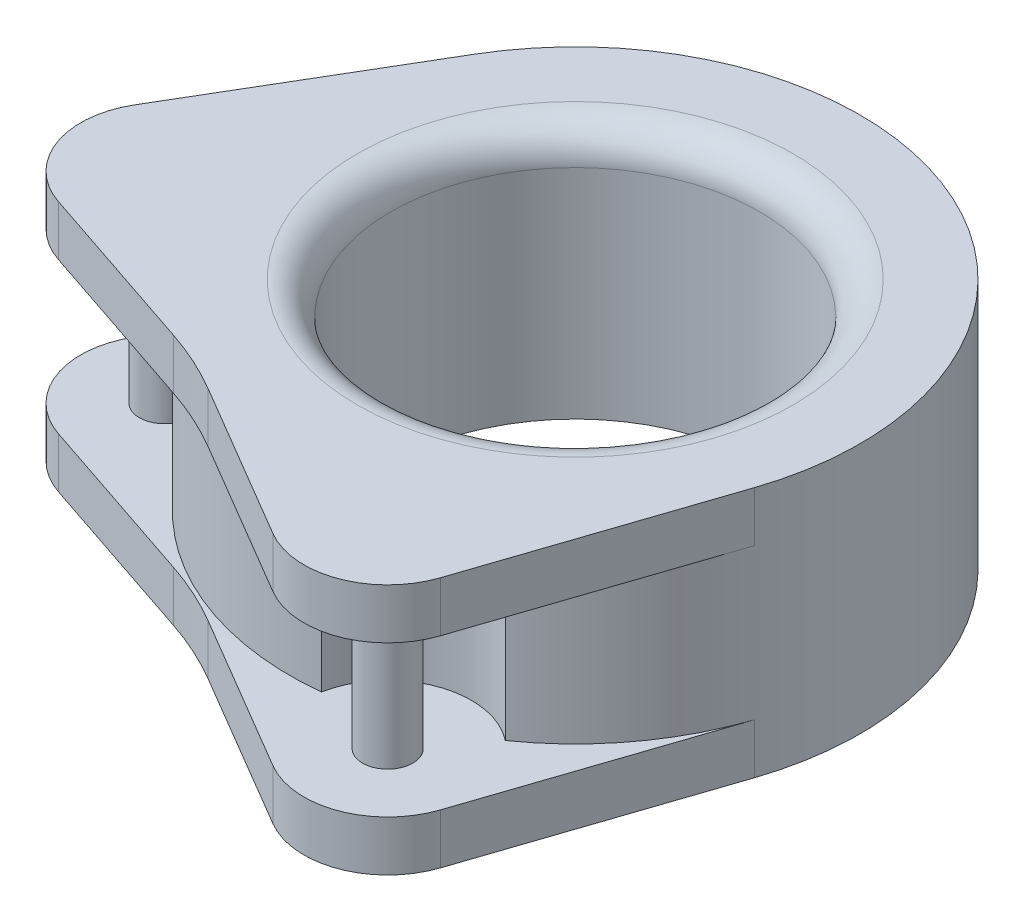
ISO-10303-21;
HEADER;
FILE_DESCRIPTION(('STEP AP214'),'2;1');
FILE_NAME('part.step','',(''),(''),'','','');
FILE_SCHEMA(('AUTOMOTIVE_DESIGN { 1 0 10303 214 1 1 1 1 }'));
ENDSEC;
DATA;
#1=APPLICATION_CONTEXT('core data for automotive mechanical design processes');
#2=APPLICATION_PROTOCOL_DEFINITION('international standard','automotive_design',2000,#1);
#3=PRODUCT_CONTEXT('',#1,'mechanical');
#4=PRODUCT('Part','Part','',(#3));
#5=PRODUCT_RELATED_PRODUCT_CATEGORY('part','',(#4));
#6=PRODUCT_DEFINITION_FORMATION('','',#4);
#7=PRODUCT_DEFINITION_CONTEXT('part definition',#1,'design');
#8=PRODUCT_DEFINITION('design','',#6,#7);
#9=PRODUCT_DEFINITION_SHAPE('','',#8);
#10=(LENGTH_UNIT() NAMED_UNIT(*) SI_UNIT(.MILLI.,.METRE.));
#11=(NAMED_UNIT(*) PLANE_ANGLE_UNIT() SI_UNIT($,.RADIAN.));
#12=(NAMED_UNIT(*) SI_UNIT($,.STERADIAN.) SOLID_ANGLE_UNIT());
#13=UNCERTAINTY_MEASURE_WITH_UNIT(LENGTH_MEASURE(1.E-05),#10,'distance_accuracy_value','');
#14=(GEOMETRIC_REPRESENTATION_CONTEXT(3) GLOBAL_UNCERTAINTY_ASSIGNED_CONTEXT((#13)) GLOBAL_UNIT_ASSIGNED_CONTEXT((#10,
#11,#12)) REPRESENTATION_CONTEXT('',''));
#15=CARTESIAN_POINT('',(0.,0.,0.));
#16=DIRECTION('',(0.,0.,1.));
#17=DIRECTION('',(1.,0.,0.));
#18=AXIS2_PLACEMENT_3D('',#15,#16,#17);
#19=CARTESIAN_POINT('',(-14.6450677837833,-31.7471230269605,-8.63261198064591));
#20=DIRECTION('',(-0.861474575516667,0.,-0.507800704743877));
#21=DIRECTION('',(-0.507800704743877,0.,0.861474575516667));
#22=AXIS2_PLACEMENT_3D('',#19,#20,#21);
#23=PLANE('',#22);
#24=DIRECTION('',(0.,1.,0.));
#25=VECTOR('',#24,1.);
#26=CARTESIAN_POINT('',(-22.1639271566175,-31.7471230269605,4.12299494559652));
#27=LINE('',#26,#25);
#28=CARTESIAN_POINT('',(-22.1639271566175,0.,4.12299494559653));
#29=VERTEX_POINT('',#28);
#30=CARTESIAN_POINT('',(-22.1639271566175,3.,4.12299494559652));
#31=VERTEX_POINT('',#30);
#32=EDGE_CURVE('E191',#29,#31,#27,.T.);
#33=ORIENTED_EDGE('',*,*,#32,.T.);
#34=DIRECTION('',(0.507800704743877,0.,-0.861474575516667));
#35=VECTOR('',#34,1.);
#36=CARTESIAN_POINT('',(-14.6450677837833,3.,-8.63261198064591));
#37=LINE('',#36,#35);
#38=CARTESIAN_POINT('',(-14.6450677837833,3.,-8.63261198064592));
#39=VERTEX_POINT('',#38);
#40=EDGE_CURVE('E177',#31,#39,#37,.T.);
#41=ORIENTED_EDGE('',*,*,#40,.T.);
#42=DIRECTION('',(0.,1.,0.));
#43=VECTOR('',#42,1.);
#44=CARTESIAN_POINT('',(-14.6450677837833,-31.7471230269605,-8.63261198064592));
#45=LINE('',#44,#43);
#46=CARTESIAN_POINT('',(-14.6450677837833,0.,-8.63261198064592));
#47=VERTEX_POINT('',#46);
#48=EDGE_CURVE('E189',#47,#39,#45,.T.);
#49=ORIENTED_EDGE('',*,*,#48,.F.);
#50=DIRECTION('',(0.507800704743877,0.,-0.861474575516667));
#51=VECTOR('',#50,1.);
#52=CARTESIAN_POINT('',(-14.6450677837833,0.,-8.63261198064591));
#53=LINE('',#52,#51);
#54=EDGE_CURVE('E198',#29,#47,#53,.T.);
#55=ORIENTED_EDGE('',*,*,#54,.F.);
#56=EDGE_LOOP('',(#33,#41,#49,#55));
#57=FACE_BOUND('',#56,.T.);
#58=ADVANCED_FACE('F35',(#57),#23,.T.);
#59=CARTESIAN_POINT('',(-25.2967852286317,-31.7471230269605,9.4378311648642));
#60=DIRECTION('',(-0.318348055173974,0.,0.947973900361686));
#61=DIRECTION('',(0.947973900361686,0.,0.318348055173974));
#62=AXIS2_PLACEMENT_3D('',#59,#60,#61);
#63=PLANE('',#62);
#64=DIRECTION('',(-0.947973900361686,0.,-0.318348055173974));
#65=VECTOR('',#64,1.);
#66=CARTESIAN_POINT('',(-25.2967852286317,0.,9.4378311648642));
#67=LINE('',#66,#65);
#68=CARTESIAN_POINT('',(-9.08433882396887,0.,14.882285680508));
#69=VERTEX_POINT('',#68);
#70=CARTESIAN_POINT('',(-19.448294554904,0.,11.4018679711243));
#71=VERTEX_POINT('',#70);
#72=EDGE_CURVE('E201',#69,#71,#67,.T.);
#73=ORIENTED_EDGE('',*,*,#72,.F.);
#74=DIRECTION('',(0.,1.,0.));
#75=VECTOR('',#74,1.);
#76=CARTESIAN_POINT('',(-9.08433882396886,3.,14.882285680508));
#77=LINE('',#76,#75);
#78=CARTESIAN_POINT('',(-9.08433882396887,3.,14.882285680508));
#79=VERTEX_POINT('',#78);
#80=EDGE_CURVE('E294',#69,#79,#77,.T.);
#81=ORIENTED_EDGE('',*,*,#80,.T.);
#82=DIRECTION('',(-0.947973900361686,0.,-0.318348055173974));
#83=VECTOR('',#82,1.);
#84=CARTESIAN_POINT('',(-5.41191693795756,3.,16.1155563061487));
#85=LINE('',#84,#83);
#86=CARTESIAN_POINT('',(-19.448294554904,3.,11.4018679711243));
#87=VERTEX_POINT('',#86);
#88=EDGE_CURVE('E386',#79,#87,#85,.T.);
#89=ORIENTED_EDGE('',*,*,#88,.T.);
#90=DIRECTION('',(0.,1.,0.));
#91=VECTOR('',#90,1.);
#92=CARTESIAN_POINT('',(-19.448294554904,-31.7471230269605,11.4018679711243));
#93=LINE('',#92,#91);
#94=EDGE_CURVE('E288',#87,#71,#93,.F.);
#95=ORIENTED_EDGE('',*,*,#94,.T.);
#96=EDGE_LOOP('',(#73,#81,#89,#95));
#97=FACE_BOUND('',#96,.T.);
#98=ADVANCED_FACE('F325',(#97),#63,.T.);
#99=CARTESIAN_POINT('',(-17.8565542790341,-31.7471230269605,6.66199846931591));
#100=DIRECTION('',(0.,1.,0.));
#101=DIRECTION('',(0.,0.,1.));
#102=AXIS2_PLACEMENT_3D('',#99,#100,#101);
#103=CYLINDRICAL_SURFACE('',#102,5.);
#104=ORIENTED_EDGE('',*,*,#94,.F.);
#105=CARTESIAN_POINT('',(-17.8565542790341,3.,6.66199846931591));
#106=DIRECTION('',(0.,1.,0.));
#107=DIRECTION('',(0.,0.,1.));
#108=AXIS2_PLACEMENT_3D('',#105,#106,#107);
#109=CIRCLE('',#108,5.);
#110=EDGE_CURVE('E192',#87,#31,#109,.F.);
#111=ORIENTED_EDGE('',*,*,#110,.T.);
#112=ORIENTED_EDGE('',*,*,#32,.F.);
#113=CARTESIAN_POINT('',(-17.8565542790341,0.,6.66199846931591));
#114=DIRECTION('',(0.,1.,0.));
#115=DIRECTION('',(0.,0.,1.));
#116=AXIS2_PLACEMENT_3D('',#113,#114,#115);
#117=CIRCLE('',#116,5.);
#118=EDGE_CURVE('E292',#71,#29,#117,.F.);
#119=ORIENTED_EDGE('',*,*,#118,.F.);
#120=EDGE_LOOP('',(#104,#111,#112,#119));
#121=FACE_BOUND('',#120,.T.);
#122=ADVANCED_FACE('F331',(#121),#103,.T.);
#123=CARTESIAN_POINT('',(0.,15.,0.));
#124=DIRECTION('',(0.,-1.,0.));
#125=DIRECTION('',(0.,0.,-1.));
#126=AXIS2_PLACEMENT_3D('',#123,#124,#125);
#127=CYLINDRICAL_SURFACE('',#126,17.);
#128=ORIENTED_EDGE('',*,*,#48,.T.);
#129=CARTESIAN_POINT('',(0.,3.,0.));
#130=DIRECTION('',(0.,1.,0.));
#131=DIRECTION('',(0.,0.,1.));
#132=AXIS2_PLACEMENT_3D('',#129,#130,#131);
#133=CIRCLE('',#132,17.);
#134=CARTESIAN_POINT('',(-16.9094252456625,3.,1.75252328411081));
#135=VERTEX_POINT('',#134);
#136=EDGE_CURVE('E172',#135,#39,#133,.F.);
#137=ORIENTED_EDGE('',*,*,#136,.F.);
#138=DIRECTION('',(0.,-1.,0.));
#139=VECTOR('',#138,1.);
#140=CARTESIAN_POINT('',(-16.9094252456625,45.2784941090733,1.75252328411081));
#141=LINE('',#140,#139);
#142=CARTESIAN_POINT('',(-16.9094252456625,12.,1.75252328411081));
#143=VERTEX_POINT('',#142);
#144=EDGE_CURVE('E365',#143,#135,#141,.T.);
#145=ORIENTED_EDGE('',*,*,#144,.F.);
#146=CARTESIAN_POINT('',(0.,12.,0.));
#147=DIRECTION('',(0.,1.,0.));
#148=DIRECTION('',(0.,0.,1.));
#149=AXIS2_PLACEMENT_3D('',#146,#147,#148);
#150=CIRCLE('',#149,17.);
#151=CARTESIAN_POINT('',(-14.6450677837833,12.,-8.63261198064592));
#152=VERTEX_POINT('',#151);
#153=EDGE_CURVE('E354',#152,#143,#150,.T.);
#154=ORIENTED_EDGE('',*,*,#153,.F.);
#155=CARTESIAN_POINT('',(-14.6450677837833,15.,-8.63261198064592));
#156=VERTEX_POINT('',#155);
#157=EDGE_CURVE('E199',#152,#156,#45,.T.);
#158=ORIENTED_EDGE('',*,*,#157,.T.);
#159=CARTESIAN_POINT('',(0.,15.,0.));
#160=DIRECTION('',(0.,1.,0.));
#161=DIRECTION('',(0.,0.,1.));
#162=AXIS2_PLACEMENT_3D('',#159,#160,#161);
#163=CIRCLE('',#162,17.);
#164=CARTESIAN_POINT('',(16.1155563061487,15.,5.4119169379575));
#165=VERTEX_POINT('',#164);
#166=EDGE_CURVE('E268',#165,#156,#163,.T.);
#167=ORIENTED_EDGE('',*,*,#166,.F.);
#168=DIRECTION('',(0.,1.,0.));
#169=VECTOR('',#168,1.);
#170=CARTESIAN_POINT('',(16.1155563061487,-31.7471230269604,5.4119169379575));
#171=LINE('',#170,#169);
#172=CARTESIAN_POINT('',(16.1155563061487,12.,5.4119169379575));
#173=VERTEX_POINT('',#172);
#174=EDGE_CURVE('E260',#173,#165,#171,.T.);
#175=ORIENTED_EDGE('',*,*,#174,.F.);
#176=CARTESIAN_POINT('',(0.,12.,0.));
#177=DIRECTION('',(0.,1.,0.));
#178=DIRECTION('',(0.,0.,1.));
#179=AXIS2_PLACEMENT_3D('',#176,#177,#178);
#180=CIRCLE('',#179,17.);
#181=CARTESIAN_POINT('',(9.75138033700104,12.,13.9251779709686));
#182=VERTEX_POINT('',#181);
#183=EDGE_CURVE('E229',#182,#173,#180,.T.);
#184=ORIENTED_EDGE('',*,*,#183,.F.);
#185=DIRECTION('',(0.,-1.,0.));
#186=VECTOR('',#185,1.);
#187=CARTESIAN_POINT('',(9.75138033700104,45.2784941090733,13.9251779709686));
#188=LINE('',#187,#186);
#189=CARTESIAN_POINT('',(9.75138033700104,3.,13.9251779709686));
#190=VERTEX_POINT('',#189);
#191=EDGE_CURVE('E244',#182,#190,#188,.T.);
#192=ORIENTED_EDGE('',*,*,#191,.T.);
#193=CARTESIAN_POINT('',(0.,3.,0.));
#194=DIRECTION('',(0.,1.,0.));
#195=DIRECTION('',(0.,0.,1.));
#196=AXIS2_PLACEMENT_3D('',#193,#194,#195);
#197=CIRCLE('',#196,17.);
#198=CARTESIAN_POINT('',(16.1155563061487,3.,5.4119169379575));
#199=VERTEX_POINT('',#198);
#200=EDGE_CURVE('E219',#199,#190,#197,.F.);
#201=ORIENTED_EDGE('',*,*,#200,.F.);
#202=CARTESIAN_POINT('',(16.1155563061487,0.,5.4119169379575));
#203=VERTEX_POINT('',#202);
#204=EDGE_CURVE('E255',#203,#199,#171,.T.);
#205=ORIENTED_EDGE('',*,*,#204,.F.);
#206=CARTESIAN_POINT('',(0.,0.,0.));
#207=DIRECTION('',(0.,1.,0.));
#208=DIRECTION('',(0.,0.,1.));
#209=AXIS2_PLACEMENT_3D('',#206,#207,#208);
#210=CIRCLE('',#209,17.);
#211=EDGE_CURVE('E197',#203,#47,#210,.T.);
#212=ORIENTED_EDGE('',*,*,#211,.T.);
#213=EDGE_LOOP('',(#128,#137,#145,#154,#158,#167,#175,#184,#192,#201,#205,#212));
#214=FACE_BOUND('',#213,.T.);
#215=ADVANCED_FACE('F195',(#214),#127,.T.);
#216=CARTESIAN_POINT('',(-8.63261198064586,-31.7471230269604,14.6450677837834));
#217=DIRECTION('',(-0.507800704743874,0.,0.861474575516669));
#218=DIRECTION('',(0.861474575516669,0.,0.507800704743874));
#219=AXIS2_PLACEMENT_3D('',#216,#217,#218);
#220=PLANE('',#219);
#221=DIRECTION('',(-0.861474575516669,0.,-0.507800704743874));
#222=VECTOR('',#221,1.);
#223=CARTESIAN_POINT('',(-8.63261198064586,3.,14.6450677837834));
#224=LINE('',#223,#222);
#225=CARTESIAN_POINT('',(4.1229949455966,3.,22.1639271566174));
#226=VERTEX_POINT('',#225);
#227=CARTESIAN_POINT('',(-5.29528583257085,3.,16.6122721774084));
#228=VERTEX_POINT('',#227);
#229=EDGE_CURVE('E210',#226,#228,#224,.T.);
#230=ORIENTED_EDGE('',*,*,#229,.T.);
#231=DIRECTION('',(0.,1.,0.));
#232=VECTOR('',#231,1.);
#233=CARTESIAN_POINT('',(-5.29528583257085,0.,16.6122721774084));
#234=LINE('',#233,#232);
#235=CARTESIAN_POINT('',(-5.29528583257085,0.,16.6122721774084));
#236=VERTEX_POINT('',#235);
#237=EDGE_CURVE('E297',#228,#236,#234,.F.);
#238=ORIENTED_EDGE('',*,*,#237,.T.);
#239=DIRECTION('',(-0.861474575516669,0.,-0.507800704743874));
#240=VECTOR('',#239,1.);
#241=CARTESIAN_POINT('',(-8.63261198064586,0.,14.6450677837834));
#242=LINE('',#241,#240);
#243=CARTESIAN_POINT('',(4.1229949455966,0.,22.1639271566174));
#244=VERTEX_POINT('',#243);
#245=EDGE_CURVE('E251',#244,#236,#242,.T.);
#246=ORIENTED_EDGE('',*,*,#245,.F.);
#247=DIRECTION('',(0.,1.,0.));
#248=VECTOR('',#247,1.);
#249=CARTESIAN_POINT('',(4.1229949455966,-31.7471230269604,22.1639271566174));
#250=LINE('',#249,#248);
#251=EDGE_CURVE('E273',#244,#226,#250,.T.);
#252=ORIENTED_EDGE('',*,*,#251,.T.);
#253=EDGE_LOOP('',(#230,#238,#246,#252));
#254=FACE_BOUND('',#253,.T.);
#255=ADVANCED_FACE('F400',(#254),#220,.T.);
#256=CARTESIAN_POINT('',(9.43783116486429,-31.7471230269604,25.2967852286317));
#257=DIRECTION('',(0.947973900361688,0.,0.318348055173971));
#258=DIRECTION('',(0.318348055173971,0.,-0.947973900361688));
#259=AXIS2_PLACEMENT_3D('',#256,#257,#258);
#260=PLANE('',#259);
#261=ORIENTED_EDGE('',*,*,#204,.T.);
#262=DIRECTION('',(-0.318348055173971,0.,0.947973900361687));
#263=VECTOR('',#262,1.);
#264=CARTESIAN_POINT('',(16.1155563061487,3.,5.4119169379575));
#265=LINE('',#264,#263);
#266=CARTESIAN_POINT('',(11.4018679711244,3.,19.448294554904));
#267=VERTEX_POINT('',#266);
#268=EDGE_CURVE('E216',#199,#267,#265,.T.);
#269=ORIENTED_EDGE('',*,*,#268,.T.);
#270=DIRECTION('',(0.,1.,0.));
#271=VECTOR('',#270,1.);
#272=CARTESIAN_POINT('',(11.4018679711244,-31.7471230269604,19.448294554904));
#273=LINE('',#272,#271);
#274=CARTESIAN_POINT('',(11.4018679711244,0.,19.448294554904));
#275=VERTEX_POINT('',#274);
#276=EDGE_CURVE('E278',#267,#275,#273,.F.);
#277=ORIENTED_EDGE('',*,*,#276,.T.);
#278=DIRECTION('',(-0.318348055173971,0.,0.947973900361688));
#279=VECTOR('',#278,1.);
#280=CARTESIAN_POINT('',(9.43783116486429,0.,25.2967852286317));
#281=LINE('',#280,#279);
#282=EDGE_CURVE('E254',#203,#275,#281,.T.);
#283=ORIENTED_EDGE('',*,*,#282,.F.);
#284=EDGE_LOOP('',(#261,#269,#277,#283));
#285=FACE_BOUND('',#284,.T.);
#286=ADVANCED_FACE('F412',(#285),#260,.T.);
#287=CARTESIAN_POINT('',(6.66199846931597,-31.7471230269604,17.8565542790341));
#288=DIRECTION('',(0.,1.,0.));
#289=DIRECTION('',(0.,0.,1.));
#290=AXIS2_PLACEMENT_3D('',#287,#288,#289);
#291=CYLINDRICAL_SURFACE('',#290,5.);
#292=ORIENTED_EDGE('',*,*,#276,.F.);
#293=CARTESIAN_POINT('',(6.66199846931597,3.,17.8565542790341));
#294=DIRECTION('',(0.,1.,0.));
#295=DIRECTION('',(0.,0.,1.));
#296=AXIS2_PLACEMENT_3D('',#293,#294,#295);
#297=CIRCLE('',#296,5.);
#298=EDGE_CURVE('E213',#267,#226,#297,.F.);
#299=ORIENTED_EDGE('',*,*,#298,.T.);
#300=ORIENTED_EDGE('',*,*,#251,.F.);
#301=CARTESIAN_POINT('',(6.66199846931597,0.,17.8565542790341));
#302=DIRECTION('',(0.,1.,0.));
#303=DIRECTION('',(0.,0.,1.));
#304=AXIS2_PLACEMENT_3D('',#301,#302,#303);
#305=CIRCLE('',#304,5.);
#306=EDGE_CURVE('E282',#275,#244,#305,.F.);
#307=ORIENTED_EDGE('',*,*,#306,.F.);
#308=EDGE_LOOP('',(#292,#299,#300,#307));
#309=FACE_BOUND('',#308,.T.);
#310=ADVANCED_FACE('F409',(#309),#291,.T.);
#311=CARTESIAN_POINT('',(0.,12.,0.));
#312=DIRECTION('',(0.,1.,0.));
#313=DIRECTION('',(0.,0.,1.));
#314=AXIS2_PLACEMENT_3D('',#311,#312,#313);
#315=CIRCLE('',#314,17.);
#316=CARTESIAN_POINT('',(-13.9251779709686,12.,9.75138033700099));
#317=VERTEX_POINT('',#316);
#318=CARTESIAN_POINT('',(1.75252328411087,12.,16.9094252456625));
#319=VERTEX_POINT('',#318);
#320=EDGE_CURVE('E239',#317,#319,#315,.T.);
#321=ORIENTED_EDGE('',*,*,#320,.F.);
#322=DIRECTION('',(0.,-1.,0.));
#323=VECTOR('',#322,1.);
#324=CARTESIAN_POINT('',(-13.9251779709686,45.2784941090733,9.75138033700099));
#325=LINE('',#324,#323);
#326=CARTESIAN_POINT('',(-13.9251779709686,3.,9.75138033700099));
#327=VERTEX_POINT('',#326);
#328=EDGE_CURVE('E366',#317,#327,#325,.T.);
#329=ORIENTED_EDGE('',*,*,#328,.T.);
#330=CARTESIAN_POINT('',(0.,3.,0.));
#331=DIRECTION('',(0.,1.,0.));
#332=DIRECTION('',(0.,0.,1.));
#333=AXIS2_PLACEMENT_3D('',#330,#331,#332);
#334=CIRCLE('',#333,17.);
#335=CARTESIAN_POINT('',(1.75252328411087,3.,16.9094252456625));
#336=VERTEX_POINT('',#335);
#337=EDGE_CURVE('E208',#336,#327,#334,.F.);
#338=ORIENTED_EDGE('',*,*,#337,.F.);
#339=DIRECTION('',(0.,-1.,0.));
#340=VECTOR('',#339,1.);
#341=CARTESIAN_POINT('',(1.75252328411087,45.2784941090733,16.9094252456625));
#342=LINE('',#341,#340);
#343=EDGE_CURVE('E246',#319,#336,#342,.T.);
#344=ORIENTED_EDGE('',*,*,#343,.F.);
#345=EDGE_LOOP('',(#321,#329,#338,#344));
#346=FACE_BOUND('',#345,.T.);
#347=ADVANCED_FACE('F421',(#346),#127,.T.);
#348=CARTESIAN_POINT('',(0.,15.,0.));
#349=DIRECTION('',(0.,1.,0.));
#350=DIRECTION('',(0.,0.,1.));
#351=AXIS2_PLACEMENT_3D('',#348,#349,#350);
#352=PLANE('',#351);
#353=CARTESIAN_POINT('',(0.,15.,0.));
#354=DIRECTION('',(0.,1.,0.));
#355=DIRECTION('',(0.,0.,1.));
#356=AXIS2_PLACEMENT_3D('',#353,#354,#355);
#357=CIRCLE('',#356,13.);
#358=CARTESIAN_POINT('',(0.,15.,13.));
#359=VERTEX_POINT('',#358);
#360=EDGE_CURVE('E12',#359,#359,#357,.F.);
#361=ORIENTED_EDGE('',*,*,#360,.T.);
#362=EDGE_LOOP('',(#361));
#363=FACE_BOUND('',#362,.T.);
#364=DIRECTION('',(-0.507800704743877,0.,0.861474575516667));
#365=VECTOR('',#364,1.);
#366=CARTESIAN_POINT('',(-14.6450677837833,15.,-8.63261198064591));
#367=LINE('',#366,#365);
#368=CARTESIAN_POINT('',(-22.1639271566175,15.,4.12299494559652));
#369=VERTEX_POINT('',#368);
#370=EDGE_CURVE('E362',#156,#369,#367,.T.);
#371=ORIENTED_EDGE('',*,*,#370,.T.);
#372=CARTESIAN_POINT('',(-17.8565542790341,15.,6.66199846931591));
#373=DIRECTION('',(0.,1.,0.));
#374=DIRECTION('',(0.,0.,1.));
#375=AXIS2_PLACEMENT_3D('',#372,#373,#374);
#376=CIRCLE('',#375,5.);
#377=CARTESIAN_POINT('',(-19.448294554904,15.,11.4018679711243));
#378=VERTEX_POINT('',#377);
#379=EDGE_CURVE('E286',#369,#378,#376,.T.);
#380=ORIENTED_EDGE('',*,*,#379,.T.);
#381=DIRECTION('',(0.947973900361686,0.,0.318348055173974));
#382=VECTOR('',#381,1.);
#383=CARTESIAN_POINT('',(-25.2967852286317,15.,9.4378311648642));
#384=LINE('',#383,#382);
#385=CARTESIAN_POINT('',(-9.08433882396887,15.,14.882285680508));
#386=VERTEX_POINT('',#385);
#387=EDGE_CURVE('E203',#378,#386,#384,.T.);
#388=ORIENTED_EDGE('',*,*,#387,.T.);
#389=CARTESIAN_POINT('',(-15.4512999274483,15.,33.8417636877418));
#390=DIRECTION('',(0.,1.,0.));
#391=DIRECTION('',(0.,0.,1.));
#392=AXIS2_PLACEMENT_3D('',#389,#390,#391);
#393=CIRCLE('',#392,20.);
#394=CARTESIAN_POINT('',(-5.29528583257085,15.,16.6122721774084));
#395=VERTEX_POINT('',#394);
#396=EDGE_CURVE('E50',#386,#395,#393,.F.);
#397=ORIENTED_EDGE('',*,*,#396,.T.);
#398=DIRECTION('',(0.861474575516669,0.,0.507800704743874));
#399=VECTOR('',#398,1.);
#400=CARTESIAN_POINT('',(-8.63261198064586,15.,14.6450677837834));
#401=LINE('',#400,#399);
#402=CARTESIAN_POINT('',(4.1229949455966,15.,22.1639271566174));
#403=VERTEX_POINT('',#402);
#404=EDGE_CURVE('E248',#395,#403,#401,.T.);
#405=ORIENTED_EDGE('',*,*,#404,.T.);
#406=CARTESIAN_POINT('',(6.66199846931597,15.,17.8565542790341));
#407=DIRECTION('',(0.,1.,0.));
#408=DIRECTION('',(0.,0.,1.));
#409=AXIS2_PLACEMENT_3D('',#406,#407,#408);
#410=CIRCLE('',#409,5.);
#411=CARTESIAN_POINT('',(11.4018679711244,15.,19.448294554904));
#412=VERTEX_POINT('',#411);
#413=EDGE_CURVE('E276',#403,#412,#410,.T.);
#414=ORIENTED_EDGE('',*,*,#413,.T.);
#415=DIRECTION('',(0.318348055173971,0.,-0.947973900361687));
#416=VECTOR('',#415,1.);
#417=CARTESIAN_POINT('',(9.43783116486429,15.,25.2967852286317));
#418=LINE('',#417,#416);
#419=EDGE_CURVE('E257',#412,#165,#418,.T.);
#420=ORIENTED_EDGE('',*,*,#419,.T.);
#421=ORIENTED_EDGE('',*,*,#166,.T.);
#422=EDGE_LOOP('',(#371,#380,#388,#397,#405,#414,#420,#421));
#423=FACE_BOUND('',#422,.T.);
#424=ADVANCED_FACE('F363',(#363,#423),#352,.T.);
#425=CARTESIAN_POINT('',(0.,0.,0.));
#426=DIRECTION('',(0.,1.,0.));
#427=DIRECTION('',(0.,0.,1.));
#428=AXIS2_PLACEMENT_3D('',#425,#426,#427);
#429=PLANE('',#428);
#430=ORIENTED_EDGE('',*,*,#245,.T.);
#431=CARTESIAN_POINT('',(-15.4512999274483,0.,33.8417636877418));
#432=DIRECTION('',(0.,1.,0.));
#433=DIRECTION('',(0.,0.,1.));
#434=AXIS2_PLACEMENT_3D('',#431,#432,#433);
#435=CIRCLE('',#434,20.);
#436=EDGE_CURVE('E305',#236,#69,#435,.T.);
#437=ORIENTED_EDGE('',*,*,#436,.T.);
#438=ORIENTED_EDGE('',*,*,#72,.T.);
#439=ORIENTED_EDGE('',*,*,#118,.T.);
#440=ORIENTED_EDGE('',*,*,#54,.T.);
#441=ORIENTED_EDGE('',*,*,#211,.F.);
#442=ORIENTED_EDGE('',*,*,#282,.T.);
#443=ORIENTED_EDGE('',*,*,#306,.T.);
#444=EDGE_LOOP('',(#430,#437,#438,#439,#440,#441,#442,#443));
#445=FACE_BOUND('',#444,.T.);
#446=CARTESIAN_POINT('',(0.,0.,0.));
#447=DIRECTION('',(0.,1.,0.));
#448=DIRECTION('',(0.,0.,1.));
#449=AXIS2_PLACEMENT_3D('',#446,#447,#448);
#450=CIRCLE('',#449,11.);
#451=CARTESIAN_POINT('',(0.,0.,11.));
#452=VERTEX_POINT('',#451);
#453=EDGE_CURVE('E265',#452,#452,#450,.T.);
#454=ORIENTED_EDGE('',*,*,#453,.T.);
#455=EDGE_LOOP('',(#454));
#456=FACE_BOUND('',#455,.T.);
#457=ADVANCED_FACE('F403',(#445,#456),#429,.F.);
#458=CARTESIAN_POINT('',(0.,15.,0.));
#459=DIRECTION('',(0.,-1.,0.));
#460=DIRECTION('',(0.,0.,-1.));
#461=AXIS2_PLACEMENT_3D('',#458,#459,#460);
#462=CYLINDRICAL_SURFACE('',#461,11.);
#463=CARTESIAN_POINT('',(0.,13.,0.));
#464=DIRECTION('',(0.,1.,0.));
#465=DIRECTION('',(0.,0.,1.));
#466=AXIS2_PLACEMENT_3D('',#463,#464,#465);
#467=CIRCLE('',#466,11.);
#468=CARTESIAN_POINT('',(0.,13.,11.));
#469=VERTEX_POINT('',#468);
#470=EDGE_CURVE('E43',#469,#469,#467,.T.);
#471=ORIENTED_EDGE('',*,*,#470,.T.);
#472=EDGE_LOOP('',(#471));
#473=FACE_BOUND('',#472,.T.);
#474=ORIENTED_EDGE('',*,*,#453,.F.);
#475=EDGE_LOOP('',(#474));
#476=FACE_BOUND('',#475,.T.);
#477=ADVANCED_FACE('F312',(#473,#476),#462,.F.);
#478=ORIENTED_EDGE('',*,*,#404,.F.);
#479=DIRECTION('',(0.,1.,0.));
#480=VECTOR('',#479,1.);
#481=CARTESIAN_POINT('',(-5.29528583257085,12.,16.6122721774084));
#482=LINE('',#481,#480);
#483=CARTESIAN_POINT('',(-5.29528583257085,12.,16.6122721774084));
#484=VERTEX_POINT('',#483);
#485=EDGE_CURVE('E57',#395,#484,#482,.F.);
#486=ORIENTED_EDGE('',*,*,#485,.T.);
#487=DIRECTION('',(0.861474575516669,0.,0.507800704743874));
#488=VECTOR('',#487,1.);
#489=CARTESIAN_POINT('',(-8.63261198064586,12.,14.6450677837834));
#490=LINE('',#489,#488);
#491=CARTESIAN_POINT('',(4.1229949455966,12.,22.1639271566174));
#492=VERTEX_POINT('',#491);
#493=EDGE_CURVE('E237',#484,#492,#490,.T.);
#494=ORIENTED_EDGE('',*,*,#493,.T.);
#495=EDGE_CURVE('E271',#492,#403,#250,.T.);
#496=ORIENTED_EDGE('',*,*,#495,.T.);
#497=EDGE_LOOP('',(#478,#486,#494,#496));
#498=FACE_BOUND('',#497,.T.);
#499=ADVANCED_FACE('F439',(#498),#220,.T.);
#500=DIRECTION('',(0.318348055173971,0.,-0.947973900361687));
#501=VECTOR('',#500,1.);
#502=CARTESIAN_POINT('',(16.1155563061487,12.,5.4119169379575));
#503=LINE('',#502,#501);
#504=CARTESIAN_POINT('',(11.4018679711244,12.,19.448294554904));
#505=VERTEX_POINT('',#504);
#506=EDGE_CURVE('E231',#505,#173,#503,.T.);
#507=ORIENTED_EDGE('',*,*,#506,.T.);
#508=ORIENTED_EDGE('',*,*,#174,.T.);
#509=ORIENTED_EDGE('',*,*,#419,.F.);
#510=EDGE_CURVE('E279',#412,#505,#273,.F.);
#511=ORIENTED_EDGE('',*,*,#510,.T.);
#512=EDGE_LOOP('',(#507,#508,#509,#511));
#513=FACE_BOUND('',#512,.T.);
#514=ADVANCED_FACE('F429',(#513),#260,.T.);
#515=CARTESIAN_POINT('',(6.66199846931597,12.,17.8565542790341));
#516=DIRECTION('',(0.,1.,0.));
#517=DIRECTION('',(0.,0.,1.));
#518=AXIS2_PLACEMENT_3D('',#515,#516,#517);
#519=CIRCLE('',#518,5.);
#520=EDGE_CURVE('E234',#492,#505,#519,.T.);
#521=ORIENTED_EDGE('',*,*,#520,.T.);
#522=ORIENTED_EDGE('',*,*,#510,.F.);
#523=ORIENTED_EDGE('',*,*,#413,.F.);
#524=ORIENTED_EDGE('',*,*,#495,.F.);
#525=EDGE_LOOP('',(#521,#522,#523,#524));
#526=FACE_BOUND('',#525,.T.);
#527=ADVANCED_FACE('F434',(#526),#291,.T.);
#528=CARTESIAN_POINT('',(6.66199846931597,45.2784941090733,17.8565542790341));
#529=DIRECTION('',(0.,-1.,0.));
#530=DIRECTION('',(0.,0.,-1.));
#531=AXIS2_PLACEMENT_3D('',#528,#529,#530);
#532=CYLINDRICAL_SURFACE('',#531,5.);
#533=ORIENTED_EDGE('',*,*,#343,.T.);
#534=CARTESIAN_POINT('',(6.66199846931597,3.,17.8565542790341));
#535=DIRECTION('',(0.,1.,0.));
#536=DIRECTION('',(0.,0.,1.));
#537=AXIS2_PLACEMENT_3D('',#534,#535,#536);
#538=CIRCLE('',#537,5.);
#539=EDGE_CURVE('E222',#190,#336,#538,.T.);
#540=ORIENTED_EDGE('',*,*,#539,.F.);
#541=ORIENTED_EDGE('',*,*,#191,.F.);
#542=CARTESIAN_POINT('',(6.66199846931597,12.,17.8565542790341));
#543=DIRECTION('',(0.,1.,0.));
#544=DIRECTION('',(0.,0.,1.));
#545=AXIS2_PLACEMENT_3D('',#542,#543,#544);
#546=CIRCLE('',#545,5.);
#547=EDGE_CURVE('E241',#319,#182,#546,.F.);
#548=ORIENTED_EDGE('',*,*,#547,.F.);
#549=EDGE_LOOP('',(#533,#540,#541,#548));
#550=FACE_BOUND('',#549,.T.);
#551=ADVANCED_FACE('F417',(#550),#532,.F.);
#552=CARTESIAN_POINT('',(6.66199846931597,45.2784941090733,17.8565542790341));
#553=DIRECTION('',(0.,-1.,0.));
#554=DIRECTION('',(0.,0.,-1.));
#555=AXIS2_PLACEMENT_3D('',#552,#553,#554);
#556=CYLINDRICAL_SURFACE('',#555,1.5);
#557=CARTESIAN_POINT('',(6.66199846931597,12.,17.8565542790341));
#558=DIRECTION('',(0.,1.,0.));
#559=DIRECTION('',(0.,0.,1.));
#560=AXIS2_PLACEMENT_3D('',#557,#558,#559);
#561=CIRCLE('',#560,1.5);
#562=CARTESIAN_POINT('',(6.66199846931597,12.,19.3565542790341));
#563=VERTEX_POINT('',#562);
#564=EDGE_CURVE('E228',#563,#563,#561,.T.);
#565=ORIENTED_EDGE('',*,*,#564,.F.);
#566=EDGE_LOOP('',(#565));
#567=FACE_BOUND('',#566,.T.);
#568=CARTESIAN_POINT('',(6.66199846931597,3.,17.8565542790341));
#569=DIRECTION('',(0.,1.,0.));
#570=DIRECTION('',(0.,0.,1.));
#571=AXIS2_PLACEMENT_3D('',#568,#569,#570);
#572=CIRCLE('',#571,1.5);
#573=CARTESIAN_POINT('',(6.66199846931597,3.,19.3565542790341));
#574=VERTEX_POINT('',#573);
#575=EDGE_CURVE('E225',#574,#574,#572,.F.);
#576=ORIENTED_EDGE('',*,*,#575,.F.);
#577=EDGE_LOOP('',(#576));
#578=FACE_BOUND('',#577,.T.);
#579=ADVANCED_FACE('F473',(#567,#578),#556,.T.);
#580=CARTESIAN_POINT('',(0.,12.,0.));
#581=DIRECTION('',(0.,1.,0.));
#582=DIRECTION('',(0.,0.,1.));
#583=AXIS2_PLACEMENT_3D('',#580,#581,#582);
#584=PLANE('',#583);
#585=ORIENTED_EDGE('',*,*,#493,.F.);
#586=CARTESIAN_POINT('',(-15.4512999274483,12.,33.8417636877418));
#587=DIRECTION('',(0.,1.,0.));
#588=DIRECTION('',(0.,0.,1.));
#589=AXIS2_PLACEMENT_3D('',#586,#587,#588);
#590=CIRCLE('',#589,20.);
#591=CARTESIAN_POINT('',(-9.08433882396887,12.,14.882285680508));
#592=VERTEX_POINT('',#591);
#593=EDGE_CURVE('E308',#484,#592,#590,.T.);
#594=ORIENTED_EDGE('',*,*,#593,.T.);
#595=DIRECTION('',(0.947973900361686,0.,0.318348055173974));
#596=VECTOR('',#595,1.);
#597=CARTESIAN_POINT('',(-5.41191693795756,12.,16.1155563061487));
#598=LINE('',#597,#596);
#599=CARTESIAN_POINT('',(-19.448294554904,12.,11.4018679711243));
#600=VERTEX_POINT('',#599);
#601=EDGE_CURVE('E371',#600,#592,#598,.T.);
#602=ORIENTED_EDGE('',*,*,#601,.F.);
#603=CARTESIAN_POINT('',(-17.8565542790341,12.,6.66199846931591));
#604=DIRECTION('',(0.,1.,0.));
#605=DIRECTION('',(0.,0.,1.));
#606=AXIS2_PLACEMENT_3D('',#603,#604,#605);
#607=CIRCLE('',#606,5.);
#608=CARTESIAN_POINT('',(-22.1639271566175,12.,4.12299494559652));
#609=VERTEX_POINT('',#608);
#610=EDGE_CURVE('E355',#609,#600,#607,.T.);
#611=ORIENTED_EDGE('',*,*,#610,.F.);
#612=DIRECTION('',(-0.507800704743877,0.,0.861474575516667));
#613=VECTOR('',#612,1.);
#614=CARTESIAN_POINT('',(-14.6450677837833,12.,-8.63261198064591));
#615=LINE('',#614,#613);
#616=EDGE_CURVE('E348',#152,#609,#615,.T.);
#617=ORIENTED_EDGE('',*,*,#616,.F.);
#618=ORIENTED_EDGE('',*,*,#153,.T.);
#619=CARTESIAN_POINT('',(-17.8565542790341,12.,6.66199846931591));
#620=DIRECTION('',(0.,1.,0.));
#621=DIRECTION('',(0.,0.,1.));
#622=AXIS2_PLACEMENT_3D('',#619,#620,#621);
#623=CIRCLE('',#622,5.);
#624=EDGE_CURVE('E376',#143,#317,#623,.F.);
#625=ORIENTED_EDGE('',*,*,#624,.T.);
#626=ORIENTED_EDGE('',*,*,#320,.T.);
#627=ORIENTED_EDGE('',*,*,#547,.T.);
#628=ORIENTED_EDGE('',*,*,#183,.T.);
#629=ORIENTED_EDGE('',*,*,#506,.F.);
#630=ORIENTED_EDGE('',*,*,#520,.F.);
#631=EDGE_LOOP('',(#585,#594,#602,#611,#617,#618,#625,#626,#627,#628,#629,#630));
#632=FACE_BOUND('',#631,.T.);
#633=ORIENTED_EDGE('',*,*,#564,.T.);
#634=EDGE_LOOP('',(#633));
#635=FACE_BOUND('',#634,.T.);
#636=CARTESIAN_POINT('',(-17.8565542790341,12.,6.66199846931591));
#637=DIRECTION('',(0.,1.,0.));
#638=DIRECTION('',(0.,0.,1.));
#639=AXIS2_PLACEMENT_3D('',#636,#637,#638);
#640=CIRCLE('',#639,1.5);
#641=CARTESIAN_POINT('',(-17.8565542790341,12.,8.16199846931591));
#642=VERTEX_POINT('',#641);
#643=EDGE_CURVE('E369',#642,#642,#640,.T.);
#644=ORIENTED_EDGE('',*,*,#643,.T.);
#645=EDGE_LOOP('',(#644));
#646=FACE_BOUND('',#645,.T.);
#647=ADVANCED_FACE('F344',(#632,#635,#646),#584,.F.);
#648=CARTESIAN_POINT('',(0.,3.,0.));
#649=DIRECTION('',(0.,1.,0.));
#650=DIRECTION('',(0.,0.,1.));
#651=AXIS2_PLACEMENT_3D('',#648,#649,#650);
#652=PLANE('',#651);
#653=ORIENTED_EDGE('',*,*,#337,.T.);
#654=CARTESIAN_POINT('',(-17.8565542790341,3.,6.66199846931591));
#655=DIRECTION('',(0.,1.,0.));
#656=DIRECTION('',(0.,0.,1.));
#657=AXIS2_PLACEMENT_3D('',#654,#655,#656);
#658=CIRCLE('',#657,5.);
#659=EDGE_CURVE('E180',#327,#135,#658,.T.);
#660=ORIENTED_EDGE('',*,*,#659,.T.);
#661=ORIENTED_EDGE('',*,*,#136,.T.);
#662=ORIENTED_EDGE('',*,*,#40,.F.);
#663=ORIENTED_EDGE('',*,*,#110,.F.);
#664=ORIENTED_EDGE('',*,*,#88,.F.);
#665=CARTESIAN_POINT('',(-15.4512999274483,3.,33.8417636877418));
#666=DIRECTION('',(0.,1.,0.));
#667=DIRECTION('',(0.,0.,1.));
#668=AXIS2_PLACEMENT_3D('',#665,#666,#667);
#669=CIRCLE('',#668,20.);
#670=EDGE_CURVE('E303',#79,#228,#669,.F.);
#671=ORIENTED_EDGE('',*,*,#670,.T.);
#672=ORIENTED_EDGE('',*,*,#229,.F.);
#673=ORIENTED_EDGE('',*,*,#298,.F.);
#674=ORIENTED_EDGE('',*,*,#268,.F.);
#675=ORIENTED_EDGE('',*,*,#200,.T.);
#676=ORIENTED_EDGE('',*,*,#539,.T.);
#677=EDGE_LOOP('',(#653,#660,#661,#662,#663,#664,#671,#672,#673,#674,#675,#676));
#678=FACE_BOUND('',#677,.T.);
#679=ORIENTED_EDGE('',*,*,#575,.T.);
#680=EDGE_LOOP('',(#679));
#681=FACE_BOUND('',#680,.T.);
#682=CARTESIAN_POINT('',(-17.8565542790341,3.,6.66199846931591));
#683=DIRECTION('',(0.,1.,0.));
#684=DIRECTION('',(0.,0.,1.));
#685=AXIS2_PLACEMENT_3D('',#682,#683,#684);
#686=CIRCLE('',#685,1.5);
#687=CARTESIAN_POINT('',(-17.8565542790341,3.,8.16199846931591));
#688=VERTEX_POINT('',#687);
#689=EDGE_CURVE('E372',#688,#688,#686,.F.);
#690=ORIENTED_EDGE('',*,*,#689,.T.);
#691=EDGE_LOOP('',(#690));
#692=FACE_BOUND('',#691,.T.);
#693=ADVANCED_FACE('F174',(#678,#681,#692),#652,.T.);
#694=ORIENTED_EDGE('',*,*,#616,.T.);
#695=EDGE_CURVE('E284',#609,#369,#27,.T.);
#696=ORIENTED_EDGE('',*,*,#695,.T.);
#697=ORIENTED_EDGE('',*,*,#370,.F.);
#698=ORIENTED_EDGE('',*,*,#157,.F.);
#699=EDGE_LOOP('',(#694,#696,#697,#698));
#700=FACE_BOUND('',#699,.T.);
#701=ADVANCED_FACE('F327',(#700),#23,.T.);
#702=ORIENTED_EDGE('',*,*,#601,.T.);
#703=DIRECTION('',(0.,1.,0.));
#704=VECTOR('',#703,1.);
#705=CARTESIAN_POINT('',(-9.08433882396886,15.,14.882285680508));
#706=LINE('',#705,#704);
#707=EDGE_CURVE('E299',#592,#386,#706,.T.);
#708=ORIENTED_EDGE('',*,*,#707,.T.);
#709=ORIENTED_EDGE('',*,*,#387,.F.);
#710=EDGE_CURVE('E289',#378,#600,#93,.F.);
#711=ORIENTED_EDGE('',*,*,#710,.T.);
#712=EDGE_LOOP('',(#702,#708,#709,#711));
#713=FACE_BOUND('',#712,.T.);
#714=ADVANCED_FACE('F334',(#713),#63,.T.);
#715=ORIENTED_EDGE('',*,*,#610,.T.);
#716=ORIENTED_EDGE('',*,*,#710,.F.);
#717=ORIENTED_EDGE('',*,*,#379,.F.);
#718=ORIENTED_EDGE('',*,*,#695,.F.);
#719=EDGE_LOOP('',(#715,#716,#717,#718));
#720=FACE_BOUND('',#719,.T.);
#721=ADVANCED_FACE('F342',(#720),#103,.T.);
#722=CARTESIAN_POINT('',(-17.8565542790341,45.2784941090733,6.66199846931591));
#723=DIRECTION('',(0.,-1.,0.));
#724=DIRECTION('',(0.,0.,-1.));
#725=AXIS2_PLACEMENT_3D('',#722,#723,#724);
#726=CYLINDRICAL_SURFACE('',#725,5.);
#727=ORIENTED_EDGE('',*,*,#144,.T.);
#728=ORIENTED_EDGE('',*,*,#659,.F.);
#729=ORIENTED_EDGE('',*,*,#328,.F.);
#730=ORIENTED_EDGE('',*,*,#624,.F.);
#731=EDGE_LOOP('',(#727,#728,#729,#730));
#732=FACE_BOUND('',#731,.T.);
#733=ADVANCED_FACE('F424',(#732),#726,.F.);
#734=CARTESIAN_POINT('',(-17.8565542790341,45.2784941090733,6.66199846931591));
#735=DIRECTION('',(0.,-1.,0.));
#736=DIRECTION('',(0.,0.,-1.));
#737=AXIS2_PLACEMENT_3D('',#734,#735,#736);
#738=CYLINDRICAL_SURFACE('',#737,1.5);
#739=ORIENTED_EDGE('',*,*,#643,.F.);
#740=EDGE_LOOP('',(#739));
#741=FACE_BOUND('',#740,.T.);
#742=ORIENTED_EDGE('',*,*,#689,.F.);
#743=EDGE_LOOP('',(#742));
#744=FACE_BOUND('',#743,.T.);
#745=ADVANCED_FACE('F510',(#741,#744),#738,.T.);
#746=CARTESIAN_POINT('',(-15.4512999274483,-31.7471230269605,33.8417636877418));
#747=DIRECTION('',(0.,-1.,0.));
#748=DIRECTION('',(0.,0.,-1.));
#749=AXIS2_PLACEMENT_3D('',#746,#747,#748);
#750=CYLINDRICAL_SURFACE('',#749,20.);
#751=ORIENTED_EDGE('',*,*,#436,.F.);
#752=ORIENTED_EDGE('',*,*,#237,.F.);
#753=ORIENTED_EDGE('',*,*,#670,.F.);
#754=ORIENTED_EDGE('',*,*,#80,.F.);
#755=EDGE_LOOP('',(#751,#752,#753,#754));
#756=FACE_BOUND('',#755,.T.);
#757=ADVANCED_FACE('F321',(#756),#750,.F.);
#758=CARTESIAN_POINT('',(-15.4512999274483,-31.7471230269605,33.8417636877418));
#759=DIRECTION('',(0.,-1.,0.));
#760=DIRECTION('',(0.,0.,-1.));
#761=AXIS2_PLACEMENT_3D('',#758,#759,#760);
#762=CYLINDRICAL_SURFACE('',#761,20.);
#763=ORIENTED_EDGE('',*,*,#593,.F.);
#764=ORIENTED_EDGE('',*,*,#485,.F.);
#765=ORIENTED_EDGE('',*,*,#396,.F.);
#766=ORIENTED_EDGE('',*,*,#707,.F.);
#767=EDGE_LOOP('',(#763,#764,#765,#766));
#768=FACE_BOUND('',#767,.T.);
#769=ADVANCED_FACE('F316',(#768),#762,.F.);
#770=CARTESIAN_POINT('',(0.,13.,0.));
#771=DIRECTION('',(0.,1.,0.));
#772=DIRECTION('',(0.,0.,1.));
#773=AXIS2_PLACEMENT_3D('',#770,#771,#772);
#774=TOROIDAL_SURFACE('',#773,13.,2.);
#775=ORIENTED_EDGE('',*,*,#360,.F.);
#776=EDGE_LOOP('',(#775));
#777=FACE_BOUND('',#776,.T.);
#778=ORIENTED_EDGE('',*,*,#470,.F.);
#779=EDGE_LOOP('',(#778));
#780=FACE_BOUND('',#779,.T.);
#781=ADVANCED_FACE('F37',(#777,#780),#774,.T.);
#782=CLOSED_SHELL('',(#58,#98,#122,#215,#255,#286,#310,#347,#424,#457,#477,#499,#514,#527,#551,
#579,#647,#693,#701,#714,#721,#733,#745,#757,#769,#781));
#783=MANIFOLD_SOLID_BREP('B2',#782);
#784=ADVANCED_BREP_SHAPE_REPRESENTATION('',(#18,#783),#14);
#785=SHAPE_DEFINITION_REPRESENTATION(#9,#784);
ENDSEC;
END-ISO-10303-21;
